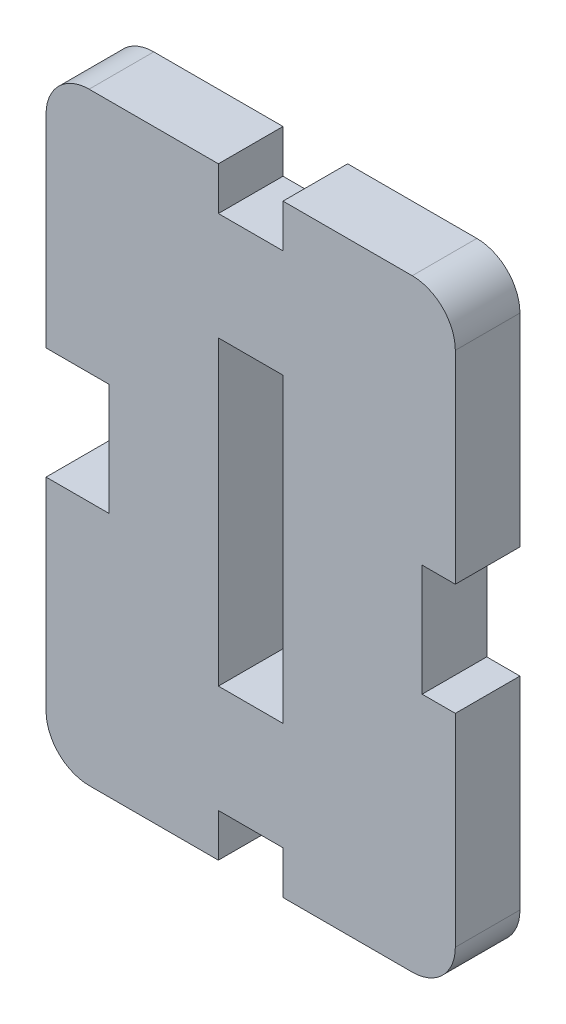
ISO-10303-21;
HEADER;
FILE_DESCRIPTION(('STEP AP214'),'2;1');
FILE_NAME('part.step','',(''),(''),'','','');
FILE_SCHEMA(('AUTOMOTIVE_DESIGN { 1 0 10303 214 1 1 1 1 }'));
ENDSEC;
DATA;
#1=APPLICATION_CONTEXT('core data for automotive mechanical design processes');
#2=APPLICATION_PROTOCOL_DEFINITION('international standard','automotive_design',2000,#1);
#3=PRODUCT_CONTEXT('',#1,'mechanical');
#4=PRODUCT('Part','Part','',(#3));
#5=PRODUCT_RELATED_PRODUCT_CATEGORY('part','',(#4));
#6=PRODUCT_DEFINITION_FORMATION('','',#4);
#7=PRODUCT_DEFINITION_CONTEXT('part definition',#1,'design');
#8=PRODUCT_DEFINITION('design','',#6,#7);
#9=PRODUCT_DEFINITION_SHAPE('','',#8);
#10=(LENGTH_UNIT() NAMED_UNIT(*) SI_UNIT(.MILLI.,.METRE.));
#11=(NAMED_UNIT(*) PLANE_ANGLE_UNIT() SI_UNIT($,.RADIAN.));
#12=(NAMED_UNIT(*) SI_UNIT($,.STERADIAN.) SOLID_ANGLE_UNIT());
#13=UNCERTAINTY_MEASURE_WITH_UNIT(LENGTH_MEASURE(1.E-05),#10,'distance_accuracy_value','');
#14=(GEOMETRIC_REPRESENTATION_CONTEXT(3) GLOBAL_UNCERTAINTY_ASSIGNED_CONTEXT((#13)) GLOBAL_UNIT_ASSIGNED_CONTEXT((#10,
#11,#12)) REPRESENTATION_CONTEXT('',''));
#15=CARTESIAN_POINT('',(0.,0.,0.));
#16=DIRECTION('',(0.,0.,1.));
#17=DIRECTION('',(1.,0.,0.));
#18=AXIS2_PLACEMENT_3D('',#15,#16,#17);
#19=CARTESIAN_POINT('',(-1050.11691061095,53.9977448376059,2.99999999999985));
#20=DIRECTION('',(0.,0.,-1.));
#21=DIRECTION('',(-1.,0.,0.));
#22=AXIS2_PLACEMENT_3D('',#19,#20,#21);
#23=PLANE('',#22);
#24=CARTESIAN_POINT('',(-1050.11691061095,53.9977448376059,2.99999999999985));
#25=DIRECTION('',(0.,0.,1.));
#26=DIRECTION('',(-1.,0.,0.));
#27=AXIS2_PLACEMENT_3D('',#24,#25,#26);
#28=CIRCLE('',#27,2.);
#29=CARTESIAN_POINT('',(-1050.11691061095,55.9977448376057,2.99999999999996));
#30=VERTEX_POINT('',#29);
#31=CARTESIAN_POINT('',(-1052.11691061095,53.9977448376056,2.99999999999989));
#32=VERTEX_POINT('',#31);
#33=EDGE_CURVE('E303',#30,#32,#28,.T.);
#34=ORIENTED_EDGE('',*,*,#33,.T.);
#35=DIRECTION('',(0.,-1.,0.));
#36=VECTOR('',#35,1.);
#37=CARTESIAN_POINT('',(-1052.11691061095,44.5930739118334,2.99999999999999));
#38=LINE('',#37,#36);
#39=CARTESIAN_POINT('',(-1052.11691061095,44.5930739118334,2.99999999999999));
#40=VERTEX_POINT('',#39);
#41=EDGE_CURVE('E306',#32,#40,#38,.T.);
#42=ORIENTED_EDGE('',*,*,#41,.T.);
#43=DIRECTION('',(1.,0.,0.));
#44=VECTOR('',#43,1.);
#45=CARTESIAN_POINT('',(-1049.19041833405,44.5930739118331,2.99999999999993));
#46=LINE('',#45,#44);
#47=CARTESIAN_POINT('',(-1049.19041833405,44.5930739118331,2.99999999999993));
#48=VERTEX_POINT('',#47);
#49=EDGE_CURVE('E308',#40,#48,#46,.T.);
#50=ORIENTED_EDGE('',*,*,#49,.T.);
#51=DIRECTION('',(0.,-1.,0.));
#52=VECTOR('',#51,1.);
#53=CARTESIAN_POINT('',(-1049.19041833405,39.4024157633782,2.99999999999998));
#54=LINE('',#53,#52);
#55=CARTESIAN_POINT('',(-1049.19041833405,39.4024157633782,2.99999999999998));
#56=VERTEX_POINT('',#55);
#57=EDGE_CURVE('E310',#48,#56,#54,.T.);
#58=ORIENTED_EDGE('',*,*,#57,.T.);
#59=DIRECTION('',(-1.,0.,0.));
#60=VECTOR('',#59,1.);
#61=CARTESIAN_POINT('',(-1049.19041833405,39.4024157633782,2.99999999999998));
#62=LINE('',#61,#60);
#63=CARTESIAN_POINT('',(-1052.11691061095,39.4024157633781,2.99999999999988));
#64=VERTEX_POINT('',#63);
#65=EDGE_CURVE('E312',#56,#64,#62,.T.);
#66=ORIENTED_EDGE('',*,*,#65,.T.);
#67=DIRECTION('',(0.,-1.,0.));
#68=VECTOR('',#67,1.);
#69=CARTESIAN_POINT('',(-1052.11691061095,39.4024157633781,2.99999999999988));
#70=LINE('',#69,#68);
#71=CARTESIAN_POINT('',(-1052.11691061095,29.9977448376057,2.99999999999979));
#72=VERTEX_POINT('',#71);
#73=EDGE_CURVE('E314',#64,#72,#70,.T.);
#74=ORIENTED_EDGE('',*,*,#73,.T.);
#75=CARTESIAN_POINT('',(-1050.11691061095,29.9977448376059,2.99999999999993));
#76=DIRECTION('',(0.,0.,1.));
#77=DIRECTION('',(1.,0.,0.));
#78=AXIS2_PLACEMENT_3D('',#75,#76,#77);
#79=CIRCLE('',#78,2.00000000000012);
#80=CARTESIAN_POINT('',(-1050.11691061095,27.9977448376057,2.99999999999996));
#81=VERTEX_POINT('',#80);
#82=EDGE_CURVE('E316',#72,#81,#79,.T.);
#83=ORIENTED_EDGE('',*,*,#82,.T.);
#84=DIRECTION('',(1.,0.,0.));
#85=VECTOR('',#84,1.);
#86=CARTESIAN_POINT('',(-1050.11691061095,27.9977448376057,2.99999999999995));
#87=LINE('',#86,#85);
#88=CARTESIAN_POINT('',(-1044.11691061095,27.9977448376058,3.00000000000009));
#89=VERTEX_POINT('',#88);
#90=EDGE_CURVE('E318',#81,#89,#87,.T.);
#91=ORIENTED_EDGE('',*,*,#90,.T.);
#92=DIRECTION('',(0.,1.,0.));
#93=VECTOR('',#92,1.);
#94=CARTESIAN_POINT('',(-1044.11691061095,29.9977448376057,3.00000000000003));
#95=LINE('',#94,#93);
#96=CARTESIAN_POINT('',(-1044.11691061095,29.9977448376057,3.00000000000003));
#97=VERTEX_POINT('',#96);
#98=EDGE_CURVE('E320',#89,#97,#95,.T.);
#99=ORIENTED_EDGE('',*,*,#98,.T.);
#100=DIRECTION('',(1.,0.,0.));
#101=VECTOR('',#100,1.);
#102=CARTESIAN_POINT('',(-1042.61691061095,29.9977448376059,2.99999999999993));
#103=LINE('',#102,#101);
#104=CARTESIAN_POINT('',(-1041.11691061095,29.9977448376059,2.99999999999993));
#105=VERTEX_POINT('',#104);
#106=EDGE_CURVE('E322',#97,#105,#103,.T.);
#107=ORIENTED_EDGE('',*,*,#106,.T.);
#108=DIRECTION('',(0.,-1.,0.));
#109=VECTOR('',#108,1.);
#110=CARTESIAN_POINT('',(-1041.11691061095,29.9977448376059,2.99999999999993));
#111=LINE('',#110,#109);
#112=CARTESIAN_POINT('',(-1041.11691061095,27.9977448376059,3.00000000000004));
#113=VERTEX_POINT('',#112);
#114=EDGE_CURVE('E324',#105,#113,#111,.T.);
#115=ORIENTED_EDGE('',*,*,#114,.T.);
#116=DIRECTION('',(1.,0.,0.));
#117=VECTOR('',#116,1.);
#118=CARTESIAN_POINT('',(-1041.11691061095,27.9977448376059,3.00000000000004));
#119=LINE('',#118,#117);
#120=CARTESIAN_POINT('',(-1035.11691061095,27.9977448376057,3.00000000000006));
#121=VERTEX_POINT('',#120);
#122=EDGE_CURVE('E326',#113,#121,#119,.T.);
#123=ORIENTED_EDGE('',*,*,#122,.T.);
#124=CARTESIAN_POINT('',(-1035.11691061095,29.9977448376057,2.99999999999991));
#125=DIRECTION('',(0.,0.,1.));
#126=DIRECTION('',(-1.,0.,0.));
#127=AXIS2_PLACEMENT_3D('',#124,#125,#126);
#128=CIRCLE('',#127,2.);
#129=CARTESIAN_POINT('',(-1033.11691061095,29.9977448376056,2.99999999999991));
#130=VERTEX_POINT('',#129);
#131=EDGE_CURVE('E328',#121,#130,#128,.T.);
#132=ORIENTED_EDGE('',*,*,#131,.T.);
#133=DIRECTION('',(0.,1.,0.));
#134=VECTOR('',#133,1.);
#135=CARTESIAN_POINT('',(-1033.11691061095,29.9977448376056,2.99999999999991));
#136=LINE('',#135,#134);
#137=CARTESIAN_POINT('',(-1033.11691061095,39.4024157633782,2.99999999999999));
#138=VERTEX_POINT('',#137);
#139=EDGE_CURVE('E330',#130,#138,#136,.T.);
#140=ORIENTED_EDGE('',*,*,#139,.T.);
#141=DIRECTION('',(-1.,0.,0.));
#142=VECTOR('',#141,1.);
#143=CARTESIAN_POINT('',(-1033.11691061095,39.4024157633782,2.99999999999999));
#144=LINE('',#143,#142);
#145=CARTESIAN_POINT('',(-1034.65769352971,39.4024157633784,3.00000000000013));
#146=VERTEX_POINT('',#145);
#147=EDGE_CURVE('E332',#138,#146,#144,.T.);
#148=ORIENTED_EDGE('',*,*,#147,.T.);
#149=DIRECTION('',(0.,1.,0.));
#150=VECTOR('',#149,1.);
#151=CARTESIAN_POINT('',(-1034.65769352971,44.5930739118334,2.99999999999999));
#152=LINE('',#151,#150);
#153=CARTESIAN_POINT('',(-1034.65769352971,44.5930739118334,2.99999999999999));
#154=VERTEX_POINT('',#153);
#155=EDGE_CURVE('E334',#146,#154,#152,.T.);
#156=ORIENTED_EDGE('',*,*,#155,.T.);
#157=DIRECTION('',(1.,0.,0.));
#158=VECTOR('',#157,1.);
#159=CARTESIAN_POINT('',(-1033.11691061095,44.5930739118332,3.00000000000004));
#160=LINE('',#159,#158);
#161=CARTESIAN_POINT('',(-1033.11691061095,44.5930739118332,3.00000000000004));
#162=VERTEX_POINT('',#161);
#163=EDGE_CURVE('E336',#154,#162,#160,.T.);
#164=ORIENTED_EDGE('',*,*,#163,.T.);
#165=DIRECTION('',(0.,1.,0.));
#166=VECTOR('',#165,1.);
#167=CARTESIAN_POINT('',(-1033.11691061095,53.9977448376056,2.99999999999991));
#168=LINE('',#167,#166);
#169=CARTESIAN_POINT('',(-1033.11691061095,53.9977448376056,2.99999999999991));
#170=VERTEX_POINT('',#169);
#171=EDGE_CURVE('E338',#162,#170,#168,.T.);
#172=ORIENTED_EDGE('',*,*,#171,.T.);
#173=CARTESIAN_POINT('',(-1035.11691061095,53.9977448376058,2.99999999999998));
#174=DIRECTION('',(0.,0.,1.));
#175=DIRECTION('',(1.,0.,0.));
#176=AXIS2_PLACEMENT_3D('',#173,#174,#175);
#177=CIRCLE('',#176,2.);
#178=CARTESIAN_POINT('',(-1035.11691061095,55.9977448376059,2.99999999999991));
#179=VERTEX_POINT('',#178);
#180=EDGE_CURVE('E340',#170,#179,#177,.T.);
#181=ORIENTED_EDGE('',*,*,#180,.T.);
#182=DIRECTION('',(-1.,0.,0.));
#183=VECTOR('',#182,1.);
#184=CARTESIAN_POINT('',(-1041.11691061095,55.9977448376058,3.00000000000013));
#185=LINE('',#184,#183);
#186=CARTESIAN_POINT('',(-1041.11691061095,55.9977448376058,3.00000000000013));
#187=VERTEX_POINT('',#186);
#188=EDGE_CURVE('E342',#179,#187,#185,.T.);
#189=ORIENTED_EDGE('',*,*,#188,.T.);
#190=DIRECTION('',(0.,-1.,0.));
#191=VECTOR('',#190,1.);
#192=CARTESIAN_POINT('',(-1041.11691061095,53.9977448376059,3.00000000000009));
#193=LINE('',#192,#191);
#194=CARTESIAN_POINT('',(-1041.11691061095,53.9977448376059,3.00000000000009));
#195=VERTEX_POINT('',#194);
#196=EDGE_CURVE('E344',#187,#195,#193,.T.);
#197=ORIENTED_EDGE('',*,*,#196,.T.);
#198=DIRECTION('',(-1.,0.,0.));
#199=VECTOR('',#198,1.);
#200=CARTESIAN_POINT('',(-1042.61691061095,53.9977448376058,2.99999999999991));
#201=LINE('',#200,#199);
#202=CARTESIAN_POINT('',(-1044.11691061095,53.9977448376058,3.00000000000009));
#203=VERTEX_POINT('',#202);
#204=EDGE_CURVE('E346',#195,#203,#201,.T.);
#205=ORIENTED_EDGE('',*,*,#204,.T.);
#206=DIRECTION('',(0.,1.,0.));
#207=VECTOR('',#206,1.);
#208=CARTESIAN_POINT('',(-1044.11691061095,53.9977448376058,3.00000000000009));
#209=LINE('',#208,#207);
#210=CARTESIAN_POINT('',(-1044.11691061095,55.9977448376059,3.0000000000001));
#211=VERTEX_POINT('',#210);
#212=EDGE_CURVE('E348',#203,#211,#209,.T.);
#213=ORIENTED_EDGE('',*,*,#212,.T.);
#214=DIRECTION('',(-1.,0.,0.));
#215=VECTOR('',#214,1.);
#216=CARTESIAN_POINT('',(-1050.11691061095,55.9977448376057,2.99999999999996));
#217=LINE('',#216,#215);
#218=EDGE_CURVE('E350',#211,#30,#217,.T.);
#219=ORIENTED_EDGE('',*,*,#218,.T.);
#220=EDGE_LOOP('',(#34,#42,#50,#58,#66,#74,#83,#91,#99,#107,#115,#123,#132,#140,#148,#156,#164,
#172,#181,#189,#197,#205,#213,#219));
#221=FACE_BOUND('',#220,.T.);
#222=DIRECTION('',(-1.,0.,0.));
#223=VECTOR('',#222,1.);
#224=CARTESIAN_POINT('',(-1041.11691061095,48.9977448376058,3.00000000000011));
#225=LINE('',#224,#223);
#226=CARTESIAN_POINT('',(-1041.11691061095,48.9977448376058,3.00000000000011));
#227=VERTEX_POINT('',#226);
#228=CARTESIAN_POINT('',(-1044.11691061095,48.9977448376058,3.00000000000004));
#229=VERTEX_POINT('',#228);
#230=EDGE_CURVE('E232',#227,#229,#225,.T.);
#231=ORIENTED_EDGE('',*,*,#230,.F.);
#232=DIRECTION('',(0.,1.,0.));
#233=VECTOR('',#232,1.);
#234=CARTESIAN_POINT('',(-1041.11691061095,34.9977448376059,3.00000000000013));
#235=LINE('',#234,#233);
#236=CARTESIAN_POINT('',(-1041.11691061095,34.9977448376059,3.00000000000013));
#237=VERTEX_POINT('',#236);
#238=EDGE_CURVE('E247',#237,#227,#235,.T.);
#239=ORIENTED_EDGE('',*,*,#238,.F.);
#240=DIRECTION('',(1.,0.,0.));
#241=VECTOR('',#240,1.);
#242=CARTESIAN_POINT('',(-1041.11691061095,34.9977448376059,3.00000000000013));
#243=LINE('',#242,#241);
#244=CARTESIAN_POINT('',(-1044.11691061095,34.9977448376058,3.00000000000006));
#245=VERTEX_POINT('',#244);
#246=EDGE_CURVE('E245',#245,#237,#243,.T.);
#247=ORIENTED_EDGE('',*,*,#246,.F.);
#248=DIRECTION('',(0.,-1.,0.));
#249=VECTOR('',#248,1.);
#250=CARTESIAN_POINT('',(-1044.11691061095,48.9977448376058,3.00000000000004));
#251=LINE('',#250,#249);
#252=EDGE_CURVE('E243',#229,#245,#251,.T.);
#253=ORIENTED_EDGE('',*,*,#252,.F.);
#254=EDGE_LOOP('',(#231,#239,#247,#253));
#255=FACE_BOUND('',#254,.T.);
#256=ADVANCED_FACE('F32',(#221,#255),#23,.F.);
#257=CARTESIAN_POINT('',(-1050.11691061095,53.9977448376059,0.));
#258=DIRECTION('',(0.,0.,-1.));
#259=DIRECTION('',(-1.,0.,0.));
#260=AXIS2_PLACEMENT_3D('',#257,#258,#259);
#261=PLANE('',#260);
#262=CARTESIAN_POINT('',(-1050.11691061095,53.9977448376059,0.));
#263=DIRECTION('',(0.,0.,1.));
#264=DIRECTION('',(-1.,0.,0.));
#265=AXIS2_PLACEMENT_3D('',#262,#263,#264);
#266=CIRCLE('',#265,2.);
#267=CARTESIAN_POINT('',(-1050.11691061095,55.9977448376057,0.));
#268=VERTEX_POINT('',#267);
#269=CARTESIAN_POINT('',(-1052.11691061095,53.9977448376056,0.));
#270=VERTEX_POINT('',#269);
#271=EDGE_CURVE('E233',#268,#270,#266,.T.);
#272=ORIENTED_EDGE('',*,*,#271,.F.);
#273=DIRECTION('',(-1.,0.,0.));
#274=VECTOR('',#273,1.);
#275=CARTESIAN_POINT('',(-1050.11691061095,55.9977448376057,0.));
#276=LINE('',#275,#274);
#277=CARTESIAN_POINT('',(-1044.11691061095,55.9977448376058,0.));
#278=VERTEX_POINT('',#277);
#279=EDGE_CURVE('E301',#278,#268,#276,.T.);
#280=ORIENTED_EDGE('',*,*,#279,.F.);
#281=DIRECTION('',(0.,1.,0.));
#282=VECTOR('',#281,1.);
#283=CARTESIAN_POINT('',(-1044.11691061095,53.9977448376058,0.));
#284=LINE('',#283,#282);
#285=CARTESIAN_POINT('',(-1044.11691061095,53.9977448376058,0.));
#286=VERTEX_POINT('',#285);
#287=EDGE_CURVE('E299',#286,#278,#284,.T.);
#288=ORIENTED_EDGE('',*,*,#287,.F.);
#289=DIRECTION('',(-1.,0.,0.));
#290=VECTOR('',#289,1.);
#291=CARTESIAN_POINT('',(-1042.61691061095,53.9977448376059,0.));
#292=LINE('',#291,#290);
#293=CARTESIAN_POINT('',(-1041.11691061095,53.9977448376059,0.));
#294=VERTEX_POINT('',#293);
#295=EDGE_CURVE('E297',#294,#286,#292,.T.);
#296=ORIENTED_EDGE('',*,*,#295,.F.);
#297=DIRECTION('',(0.,-1.,0.));
#298=VECTOR('',#297,1.);
#299=CARTESIAN_POINT('',(-1041.11691061095,53.9977448376059,0.));
#300=LINE('',#299,#298);
#301=CARTESIAN_POINT('',(-1041.11691061095,55.9977448376058,0.));
#302=VERTEX_POINT('',#301);
#303=EDGE_CURVE('E294',#302,#294,#300,.T.);
#304=ORIENTED_EDGE('',*,*,#303,.F.);
#305=DIRECTION('',(-1.,0.,0.));
#306=VECTOR('',#305,1.);
#307=CARTESIAN_POINT('',(-1041.11691061095,55.9977448376058,0.));
#308=LINE('',#307,#306);
#309=CARTESIAN_POINT('',(-1035.11691061095,55.9977448376056,0.));
#310=VERTEX_POINT('',#309);
#311=EDGE_CURVE('E292',#310,#302,#308,.T.);
#312=ORIENTED_EDGE('',*,*,#311,.F.);
#313=CARTESIAN_POINT('',(-1035.11691061095,53.9977448376057,0.));
#314=DIRECTION('',(0.,0.,1.));
#315=DIRECTION('',(1.,0.,0.));
#316=AXIS2_PLACEMENT_3D('',#313,#314,#315);
#317=CIRCLE('',#316,2.);
#318=CARTESIAN_POINT('',(-1033.11691061095,53.9977448376057,0.));
#319=VERTEX_POINT('',#318);
#320=EDGE_CURVE('E290',#319,#310,#317,.T.);
#321=ORIENTED_EDGE('',*,*,#320,.F.);
#322=DIRECTION('',(0.,1.,0.));
#323=VECTOR('',#322,1.);
#324=CARTESIAN_POINT('',(-1033.11691061095,53.9977448376057,0.));
#325=LINE('',#324,#323);
#326=CARTESIAN_POINT('',(-1033.11691061095,44.593073911833,0.));
#327=VERTEX_POINT('',#326);
#328=EDGE_CURVE('E288',#327,#319,#325,.T.);
#329=ORIENTED_EDGE('',*,*,#328,.F.);
#330=DIRECTION('',(1.,0.,0.));
#331=VECTOR('',#330,1.);
#332=CARTESIAN_POINT('',(-1033.11691061095,44.593073911833,0.));
#333=LINE('',#332,#331);
#334=CARTESIAN_POINT('',(-1034.65769352971,44.5930739118333,0.));
#335=VERTEX_POINT('',#334);
#336=EDGE_CURVE('E286',#335,#327,#333,.T.);
#337=ORIENTED_EDGE('',*,*,#336,.F.);
#338=DIRECTION('',(0.,1.,0.));
#339=VECTOR('',#338,1.);
#340=CARTESIAN_POINT('',(-1034.65769352971,44.5930739118333,0.));
#341=LINE('',#340,#339);
#342=CARTESIAN_POINT('',(-1034.65769352971,39.4024157633785,0.));
#343=VERTEX_POINT('',#342);
#344=EDGE_CURVE('E284',#343,#335,#341,.T.);
#345=ORIENTED_EDGE('',*,*,#344,.F.);
#346=DIRECTION('',(-1.,0.,0.));
#347=VECTOR('',#346,1.);
#348=CARTESIAN_POINT('',(-1033.11691061095,39.4024157633783,0.));
#349=LINE('',#348,#347);
#350=CARTESIAN_POINT('',(-1033.11691061095,39.4024157633783,0.));
#351=VERTEX_POINT('',#350);
#352=EDGE_CURVE('E282',#351,#343,#349,.T.);
#353=ORIENTED_EDGE('',*,*,#352,.F.);
#354=DIRECTION('',(0.,1.,0.));
#355=VECTOR('',#354,1.);
#356=CARTESIAN_POINT('',(-1033.11691061095,29.9977448376057,0.));
#357=LINE('',#356,#355);
#358=CARTESIAN_POINT('',(-1033.11691061095,29.9977448376057,0.));
#359=VERTEX_POINT('',#358);
#360=EDGE_CURVE('E280',#359,#351,#357,.T.);
#361=ORIENTED_EDGE('',*,*,#360,.F.);
#362=CARTESIAN_POINT('',(-1035.11691061095,29.9977448376058,0.));
#363=DIRECTION('',(0.,0.,1.));
#364=DIRECTION('',(-1.,0.,0.));
#365=AXIS2_PLACEMENT_3D('',#362,#363,#364);
#366=CIRCLE('',#365,2.);
#367=CARTESIAN_POINT('',(-1035.11691061095,27.9977448376058,0.));
#368=VERTEX_POINT('',#367);
#369=EDGE_CURVE('E278',#368,#359,#366,.T.);
#370=ORIENTED_EDGE('',*,*,#369,.F.);
#371=DIRECTION('',(1.,0.,0.));
#372=VECTOR('',#371,1.);
#373=CARTESIAN_POINT('',(-1041.11691061095,27.9977448376059,0.));
#374=LINE('',#373,#372);
#375=CARTESIAN_POINT('',(-1041.11691061095,27.9977448376059,0.));
#376=VERTEX_POINT('',#375);
#377=EDGE_CURVE('E276',#376,#368,#374,.T.);
#378=ORIENTED_EDGE('',*,*,#377,.F.);
#379=DIRECTION('',(0.,-1.,0.));
#380=VECTOR('',#379,1.);
#381=CARTESIAN_POINT('',(-1041.11691061095,29.9977448376058,0.));
#382=LINE('',#381,#380);
#383=CARTESIAN_POINT('',(-1041.11691061095,29.9977448376058,0.));
#384=VERTEX_POINT('',#383);
#385=EDGE_CURVE('E274',#384,#376,#382,.T.);
#386=ORIENTED_EDGE('',*,*,#385,.F.);
#387=DIRECTION('',(1.,0.,0.));
#388=VECTOR('',#387,1.);
#389=CARTESIAN_POINT('',(-1042.61691061095,29.997744837606,-1.11022302462516E-13));
#390=LINE('',#389,#388);
#391=CARTESIAN_POINT('',(-1044.11691061095,29.9977448376059,1.66533453693773E-13));
#392=VERTEX_POINT('',#391);
#393=EDGE_CURVE('E272',#392,#384,#390,.T.);
#394=ORIENTED_EDGE('',*,*,#393,.F.);
#395=DIRECTION('',(0.,1.,0.));
#396=VECTOR('',#395,1.);
#397=CARTESIAN_POINT('',(-1044.11691061095,29.9977448376059,1.66533453693773E-13));
#398=LINE('',#397,#396);
#399=CARTESIAN_POINT('',(-1044.11691061095,27.9977448376057,0.));
#400=VERTEX_POINT('',#399);
#401=EDGE_CURVE('E269',#400,#392,#398,.T.);
#402=ORIENTED_EDGE('',*,*,#401,.F.);
#403=DIRECTION('',(1.,0.,0.));
#404=VECTOR('',#403,1.);
#405=CARTESIAN_POINT('',(-1050.11691061095,27.9977448376057,0.));
#406=LINE('',#405,#404);
#407=CARTESIAN_POINT('',(-1050.11691061095,27.9977448376057,0.));
#408=VERTEX_POINT('',#407);
#409=EDGE_CURVE('E267',#408,#400,#406,.T.);
#410=ORIENTED_EDGE('',*,*,#409,.F.);
#411=CARTESIAN_POINT('',(-1050.11691061095,29.9977448376056,0.));
#412=DIRECTION('',(0.,0.,1.));
#413=DIRECTION('',(1.,0.,0.));
#414=AXIS2_PLACEMENT_3D('',#411,#412,#413);
#415=CIRCLE('',#414,2.00000000000012);
#416=CARTESIAN_POINT('',(-1052.11691061095,29.9977448376057,0.));
#417=VERTEX_POINT('',#416);
#418=EDGE_CURVE('E265',#417,#408,#415,.T.);
#419=ORIENTED_EDGE('',*,*,#418,.F.);
#420=DIRECTION('',(0.,-1.,0.));
#421=VECTOR('',#420,1.);
#422=CARTESIAN_POINT('',(-1052.11691061095,39.4024157633781,0.));
#423=LINE('',#422,#421);
#424=CARTESIAN_POINT('',(-1052.11691061095,39.4024157633781,0.));
#425=VERTEX_POINT('',#424);
#426=EDGE_CURVE('E263',#425,#417,#423,.T.);
#427=ORIENTED_EDGE('',*,*,#426,.F.);
#428=DIRECTION('',(-1.,0.,0.));
#429=VECTOR('',#428,1.);
#430=CARTESIAN_POINT('',(-1049.19041833405,39.4024157633781,-1.11022302462516E-13));
#431=LINE('',#430,#429);
#432=CARTESIAN_POINT('',(-1049.19041833405,39.4024157633781,-1.11022302462516E-13));
#433=VERTEX_POINT('',#432);
#434=EDGE_CURVE('E261',#433,#425,#431,.T.);
#435=ORIENTED_EDGE('',*,*,#434,.F.);
#436=DIRECTION('',(0.,-1.,0.));
#437=VECTOR('',#436,1.);
#438=CARTESIAN_POINT('',(-1049.19041833405,39.4024157633781,-1.11022302462516E-13));
#439=LINE('',#438,#437);
#440=CARTESIAN_POINT('',(-1049.19041833405,44.5930739118332,0.));
#441=VERTEX_POINT('',#440);
#442=EDGE_CURVE('E259',#441,#433,#439,.T.);
#443=ORIENTED_EDGE('',*,*,#442,.F.);
#444=DIRECTION('',(1.,0.,0.));
#445=VECTOR('',#444,1.);
#446=CARTESIAN_POINT('',(-1049.19041833405,44.5930739118332,0.));
#447=LINE('',#446,#445);
#448=CARTESIAN_POINT('',(-1052.11691061095,44.593073911833,0.));
#449=VERTEX_POINT('',#448);
#450=EDGE_CURVE('E257',#449,#441,#447,.T.);
#451=ORIENTED_EDGE('',*,*,#450,.F.);
#452=DIRECTION('',(0.,-1.,0.));
#453=VECTOR('',#452,1.);
#454=CARTESIAN_POINT('',(-1052.11691061095,44.593073911833,0.));
#455=LINE('',#454,#453);
#456=EDGE_CURVE('E255',#270,#449,#455,.T.);
#457=ORIENTED_EDGE('',*,*,#456,.F.);
#458=EDGE_LOOP('',(#272,#280,#288,#296,#304,#312,#321,#329,#337,#345,#353,#361,#370,#378,#386,
#394,#402,#410,#419,#427,#435,#443,#451,#457));
#459=FACE_BOUND('',#458,.T.);
#460=DIRECTION('',(0.,1.,0.));
#461=VECTOR('',#460,1.);
#462=CARTESIAN_POINT('',(-1041.11691061095,34.9977448376058,0.));
#463=LINE('',#462,#461);
#464=CARTESIAN_POINT('',(-1041.11691061095,34.9977448376058,0.));
#465=VERTEX_POINT('',#464);
#466=CARTESIAN_POINT('',(-1041.11691061095,48.9977448376059,0.));
#467=VERTEX_POINT('',#466);
#468=EDGE_CURVE('E237',#465,#467,#463,.T.);
#469=ORIENTED_EDGE('',*,*,#468,.T.);
#470=DIRECTION('',(-1.,0.,0.));
#471=VECTOR('',#470,1.);
#472=CARTESIAN_POINT('',(-1041.11691061095,48.9977448376059,0.));
#473=LINE('',#472,#471);
#474=CARTESIAN_POINT('',(-1044.11691061095,48.9977448376059,0.));
#475=VERTEX_POINT('',#474);
#476=EDGE_CURVE('E55',#467,#475,#473,.T.);
#477=ORIENTED_EDGE('',*,*,#476,.T.);
#478=DIRECTION('',(0.,-1.,0.));
#479=VECTOR('',#478,1.);
#480=CARTESIAN_POINT('',(-1044.11691061095,48.9977448376059,0.));
#481=LINE('',#480,#479);
#482=CARTESIAN_POINT('',(-1044.11691061095,34.9977448376057,0.));
#483=VERTEX_POINT('',#482);
#484=EDGE_CURVE('E219',#475,#483,#481,.T.);
#485=ORIENTED_EDGE('',*,*,#484,.T.);
#486=DIRECTION('',(1.,0.,0.));
#487=VECTOR('',#486,1.);
#488=CARTESIAN_POINT('',(-1041.11691061095,34.9977448376058,0.));
#489=LINE('',#488,#487);
#490=EDGE_CURVE('E228',#483,#465,#489,.T.);
#491=ORIENTED_EDGE('',*,*,#490,.T.);
#492=EDGE_LOOP('',(#469,#477,#485,#491));
#493=FACE_BOUND('',#492,.T.);
#494=ADVANCED_FACE('F236',(#459,#493),#261,.T.);
#495=CARTESIAN_POINT('',(-1050.11691061095,53.9977448376059,2.99999999999985));
#496=DIRECTION('',(0.,0.,-1.));
#497=DIRECTION('',(-1.,0.,0.));
#498=AXIS2_PLACEMENT_3D('',#495,#496,#497);
#499=CYLINDRICAL_SURFACE('',#498,2.);
#500=ORIENTED_EDGE('',*,*,#271,.T.);
#501=DIRECTION('',(0.,0.,-1.));
#502=VECTOR('',#501,1.);
#503=CARTESIAN_POINT('',(-1052.11691061095,53.9977448376056,2.99999999999989));
#504=LINE('',#503,#502);
#505=EDGE_CURVE('E11',#32,#270,#504,.T.);
#506=ORIENTED_EDGE('',*,*,#505,.F.);
#507=ORIENTED_EDGE('',*,*,#33,.F.);
#508=DIRECTION('',(0.,0.,-1.));
#509=VECTOR('',#508,1.);
#510=CARTESIAN_POINT('',(-1050.11691061095,55.9977448376057,2.99999999999996));
#511=LINE('',#510,#509);
#512=EDGE_CURVE('E352',#30,#268,#511,.T.);
#513=ORIENTED_EDGE('',*,*,#512,.T.);
#514=EDGE_LOOP('',(#500,#506,#507,#513));
#515=FACE_BOUND('',#514,.T.);
#516=ADVANCED_FACE('F34',(#515),#499,.T.);
#517=CARTESIAN_POINT('',(-1052.11691061095,44.5930739118334,2.99999999999999));
#518=DIRECTION('',(1.,0.,0.));
#519=DIRECTION('',(0.,1.,0.));
#520=AXIS2_PLACEMENT_3D('',#517,#518,#519);
#521=PLANE('',#520);
#522=ORIENTED_EDGE('',*,*,#456,.T.);
#523=DIRECTION('',(0.,0.,-1.));
#524=VECTOR('',#523,1.);
#525=CARTESIAN_POINT('',(-1052.11691061095,44.5930739118334,2.99999999999999));
#526=LINE('',#525,#524);
#527=EDGE_CURVE('E40',#40,#449,#526,.T.);
#528=ORIENTED_EDGE('',*,*,#527,.F.);
#529=ORIENTED_EDGE('',*,*,#41,.F.);
#530=ORIENTED_EDGE('',*,*,#505,.T.);
#531=EDGE_LOOP('',(#522,#528,#529,#530));
#532=FACE_BOUND('',#531,.T.);
#533=ADVANCED_FACE('F444',(#532),#521,.F.);
#534=CARTESIAN_POINT('',(-1049.19041833405,44.5930739118331,2.99999999999993));
#535=DIRECTION('',(0.,1.,0.));
#536=DIRECTION('',(0.,0.,1.));
#537=AXIS2_PLACEMENT_3D('',#534,#535,#536);
#538=PLANE('',#537);
#539=ORIENTED_EDGE('',*,*,#450,.T.);
#540=DIRECTION('',(0.,0.,-1.));
#541=VECTOR('',#540,1.);
#542=CARTESIAN_POINT('',(-1049.19041833405,44.5930739118331,2.99999999999993));
#543=LINE('',#542,#541);
#544=EDGE_CURVE('E415',#48,#441,#543,.T.);
#545=ORIENTED_EDGE('',*,*,#544,.F.);
#546=ORIENTED_EDGE('',*,*,#49,.F.);
#547=ORIENTED_EDGE('',*,*,#527,.T.);
#548=EDGE_LOOP('',(#539,#545,#546,#547));
#549=FACE_BOUND('',#548,.T.);
#550=ADVANCED_FACE('F422',(#549),#538,.F.);
#551=CARTESIAN_POINT('',(-1049.19041833405,39.4024157633782,2.99999999999998));
#552=DIRECTION('',(1.,0.,0.));
#553=DIRECTION('',(0.,0.,-1.));
#554=AXIS2_PLACEMENT_3D('',#551,#552,#553);
#555=PLANE('',#554);
#556=ORIENTED_EDGE('',*,*,#442,.T.);
#557=DIRECTION('',(0.,0.,-1.));
#558=VECTOR('',#557,1.);
#559=CARTESIAN_POINT('',(-1049.19041833405,39.4024157633782,2.99999999999998));
#560=LINE('',#559,#558);
#561=EDGE_CURVE('E412',#56,#433,#560,.T.);
#562=ORIENTED_EDGE('',*,*,#561,.F.);
#563=ORIENTED_EDGE('',*,*,#57,.F.);
#564=ORIENTED_EDGE('',*,*,#544,.T.);
#565=EDGE_LOOP('',(#556,#562,#563,#564));
#566=FACE_BOUND('',#565,.T.);
#567=ADVANCED_FACE('F432',(#566),#555,.F.);
#568=CARTESIAN_POINT('',(-1049.19041833405,39.4024157633782,2.99999999999998));
#569=DIRECTION('',(0.,-1.,0.));
#570=DIRECTION('',(0.,0.,-1.));
#571=AXIS2_PLACEMENT_3D('',#568,#569,#570);
#572=PLANE('',#571);
#573=ORIENTED_EDGE('',*,*,#434,.T.);
#574=DIRECTION('',(0.,0.,-1.));
#575=VECTOR('',#574,1.);
#576=CARTESIAN_POINT('',(-1052.11691061095,39.4024157633781,2.99999999999988));
#577=LINE('',#576,#575);
#578=EDGE_CURVE('E409',#64,#425,#577,.T.);
#579=ORIENTED_EDGE('',*,*,#578,.F.);
#580=ORIENTED_EDGE('',*,*,#65,.F.);
#581=ORIENTED_EDGE('',*,*,#561,.T.);
#582=EDGE_LOOP('',(#573,#579,#580,#581));
#583=FACE_BOUND('',#582,.T.);
#584=ADVANCED_FACE('F436',(#583),#572,.F.);
#585=CARTESIAN_POINT('',(-1052.11691061095,39.4024157633781,2.99999999999988));
#586=DIRECTION('',(1.,0.,0.));
#587=DIRECTION('',(0.,1.,0.));
#588=AXIS2_PLACEMENT_3D('',#585,#586,#587);
#589=PLANE('',#588);
#590=ORIENTED_EDGE('',*,*,#426,.T.);
#591=DIRECTION('',(0.,0.,-1.));
#592=VECTOR('',#591,1.);
#593=CARTESIAN_POINT('',(-1052.11691061095,29.9977448376057,2.99999999999979));
#594=LINE('',#593,#592);
#595=EDGE_CURVE('E406',#72,#417,#594,.T.);
#596=ORIENTED_EDGE('',*,*,#595,.F.);
#597=ORIENTED_EDGE('',*,*,#73,.F.);
#598=ORIENTED_EDGE('',*,*,#578,.T.);
#599=EDGE_LOOP('',(#590,#596,#597,#598));
#600=FACE_BOUND('',#599,.T.);
#601=ADVANCED_FACE('F535',(#600),#589,.F.);
#602=CARTESIAN_POINT('',(-1050.11691061095,29.9977448376059,2.99999999999993));
#603=DIRECTION('',(0.,0.,-1.));
#604=DIRECTION('',(-1.,0.,0.));
#605=AXIS2_PLACEMENT_3D('',#602,#603,#604);
#606=CYLINDRICAL_SURFACE('',#605,2.00000000000012);
#607=ORIENTED_EDGE('',*,*,#418,.T.);
#608=DIRECTION('',(0.,0.,-1.));
#609=VECTOR('',#608,1.);
#610=CARTESIAN_POINT('',(-1050.11691061095,27.9977448376057,2.99999999999996));
#611=LINE('',#610,#609);
#612=EDGE_CURVE('E403',#81,#408,#611,.T.);
#613=ORIENTED_EDGE('',*,*,#612,.F.);
#614=ORIENTED_EDGE('',*,*,#82,.F.);
#615=ORIENTED_EDGE('',*,*,#595,.T.);
#616=EDGE_LOOP('',(#607,#613,#614,#615));
#617=FACE_BOUND('',#616,.T.);
#618=ADVANCED_FACE('F533',(#617),#606,.T.);
#619=CARTESIAN_POINT('',(-1050.11691061095,27.9977448376057,2.99999999999995));
#620=DIRECTION('',(0.,1.,0.));
#621=DIRECTION('',(-1.,0.,0.));
#622=AXIS2_PLACEMENT_3D('',#619,#620,#621);
#623=PLANE('',#622);
#624=ORIENTED_EDGE('',*,*,#409,.T.);
#625=DIRECTION('',(0.,0.,-1.));
#626=VECTOR('',#625,1.);
#627=CARTESIAN_POINT('',(-1044.11691061095,27.9977448376058,3.00000000000009));
#628=LINE('',#627,#626);
#629=EDGE_CURVE('E400',#89,#400,#628,.T.);
#630=ORIENTED_EDGE('',*,*,#629,.F.);
#631=ORIENTED_EDGE('',*,*,#90,.F.);
#632=ORIENTED_EDGE('',*,*,#612,.T.);
#633=EDGE_LOOP('',(#624,#630,#631,#632));
#634=FACE_BOUND('',#633,.T.);
#635=ADVANCED_FACE('F530',(#634),#623,.F.);
#636=CARTESIAN_POINT('',(-1044.11691061095,29.9977448376057,3.00000000000003));
#637=DIRECTION('',(-1.,0.,0.));
#638=DIRECTION('',(0.,0.,1.));
#639=AXIS2_PLACEMENT_3D('',#636,#637,#638);
#640=PLANE('',#639);
#641=ORIENTED_EDGE('',*,*,#401,.T.);
#642=DIRECTION('',(0.,0.,-1.));
#643=VECTOR('',#642,1.);
#644=CARTESIAN_POINT('',(-1044.11691061095,29.9977448376057,3.00000000000003));
#645=LINE('',#644,#643);
#646=EDGE_CURVE('E397',#97,#392,#645,.T.);
#647=ORIENTED_EDGE('',*,*,#646,.F.);
#648=ORIENTED_EDGE('',*,*,#98,.F.);
#649=ORIENTED_EDGE('',*,*,#629,.T.);
#650=EDGE_LOOP('',(#641,#647,#648,#649));
#651=FACE_BOUND('',#650,.T.);
#652=ADVANCED_FACE('F521',(#651),#640,.F.);
#653=CARTESIAN_POINT('',(-1042.61691061095,29.9977448376059,2.99999999999993));
#654=DIRECTION('',(0.,1.,0.));
#655=DIRECTION('',(0.,0.,1.));
#656=AXIS2_PLACEMENT_3D('',#653,#654,#655);
#657=PLANE('',#656);
#658=ORIENTED_EDGE('',*,*,#393,.T.);
#659=DIRECTION('',(0.,0.,-1.));
#660=VECTOR('',#659,1.);
#661=CARTESIAN_POINT('',(-1041.11691061095,29.9977448376059,2.99999999999993));
#662=LINE('',#661,#660);
#663=EDGE_CURVE('E394',#105,#384,#662,.T.);
#664=ORIENTED_EDGE('',*,*,#663,.F.);
#665=ORIENTED_EDGE('',*,*,#106,.F.);
#666=ORIENTED_EDGE('',*,*,#646,.T.);
#667=EDGE_LOOP('',(#658,#664,#665,#666));
#668=FACE_BOUND('',#667,.T.);
#669=ADVANCED_FACE('F525',(#668),#657,.F.);
#670=CARTESIAN_POINT('',(-1041.11691061095,29.9977448376059,2.99999999999993));
#671=DIRECTION('',(1.,0.,0.));
#672=DIRECTION('',(0.,0.,-1.));
#673=AXIS2_PLACEMENT_3D('',#670,#671,#672);
#674=PLANE('',#673);
#675=ORIENTED_EDGE('',*,*,#385,.T.);
#676=DIRECTION('',(0.,0.,-1.));
#677=VECTOR('',#676,1.);
#678=CARTESIAN_POINT('',(-1041.11691061095,27.9977448376059,3.00000000000004));
#679=LINE('',#678,#677);
#680=EDGE_CURVE('E391',#113,#376,#679,.T.);
#681=ORIENTED_EDGE('',*,*,#680,.F.);
#682=ORIENTED_EDGE('',*,*,#114,.F.);
#683=ORIENTED_EDGE('',*,*,#663,.T.);
#684=EDGE_LOOP('',(#675,#681,#682,#683));
#685=FACE_BOUND('',#684,.T.);
#686=ADVANCED_FACE('F514',(#685),#674,.F.);
#687=CARTESIAN_POINT('',(-1041.11691061095,27.9977448376059,3.00000000000004));
#688=DIRECTION('',(0.,1.,0.));
#689=DIRECTION('',(0.,0.,1.));
#690=AXIS2_PLACEMENT_3D('',#687,#688,#689);
#691=PLANE('',#690);
#692=ORIENTED_EDGE('',*,*,#377,.T.);
#693=DIRECTION('',(0.,0.,-1.));
#694=VECTOR('',#693,1.);
#695=CARTESIAN_POINT('',(-1035.11691061095,27.9977448376057,3.00000000000006));
#696=LINE('',#695,#694);
#697=EDGE_CURVE('E388',#121,#368,#696,.T.);
#698=ORIENTED_EDGE('',*,*,#697,.F.);
#699=ORIENTED_EDGE('',*,*,#122,.F.);
#700=ORIENTED_EDGE('',*,*,#680,.T.);
#701=EDGE_LOOP('',(#692,#698,#699,#700));
#702=FACE_BOUND('',#701,.T.);
#703=ADVANCED_FACE('F510',(#702),#691,.F.);
#704=CARTESIAN_POINT('',(-1035.11691061095,29.9977448376057,2.99999999999991));
#705=DIRECTION('',(0.,0.,-1.));
#706=DIRECTION('',(-1.,0.,0.));
#707=AXIS2_PLACEMENT_3D('',#704,#705,#706);
#708=CYLINDRICAL_SURFACE('',#707,2.);
#709=ORIENTED_EDGE('',*,*,#369,.T.);
#710=DIRECTION('',(0.,0.,-1.));
#711=VECTOR('',#710,1.);
#712=CARTESIAN_POINT('',(-1033.11691061095,29.9977448376056,2.99999999999991));
#713=LINE('',#712,#711);
#714=EDGE_CURVE('E385',#130,#359,#713,.T.);
#715=ORIENTED_EDGE('',*,*,#714,.F.);
#716=ORIENTED_EDGE('',*,*,#131,.F.);
#717=ORIENTED_EDGE('',*,*,#697,.T.);
#718=EDGE_LOOP('',(#709,#715,#716,#717));
#719=FACE_BOUND('',#718,.T.);
#720=ADVANCED_FACE('F505',(#719),#708,.T.);
#721=CARTESIAN_POINT('',(-1033.11691061095,29.9977448376056,2.99999999999991));
#722=DIRECTION('',(-1.,0.,0.));
#723=DIRECTION('',(0.,0.,1.));
#724=AXIS2_PLACEMENT_3D('',#721,#722,#723);
#725=PLANE('',#724);
#726=ORIENTED_EDGE('',*,*,#360,.T.);
#727=DIRECTION('',(0.,0.,-1.));
#728=VECTOR('',#727,1.);
#729=CARTESIAN_POINT('',(-1033.11691061095,39.4024157633782,2.99999999999999));
#730=LINE('',#729,#728);
#731=EDGE_CURVE('E382',#138,#351,#730,.T.);
#732=ORIENTED_EDGE('',*,*,#731,.F.);
#733=ORIENTED_EDGE('',*,*,#139,.F.);
#734=ORIENTED_EDGE('',*,*,#714,.T.);
#735=EDGE_LOOP('',(#726,#732,#733,#734));
#736=FACE_BOUND('',#735,.T.);
#737=ADVANCED_FACE('F499',(#736),#725,.F.);
#738=CARTESIAN_POINT('',(-1033.11691061095,39.4024157633782,2.99999999999999));
#739=DIRECTION('',(0.,-1.,0.));
#740=DIRECTION('',(0.,0.,-1.));
#741=AXIS2_PLACEMENT_3D('',#738,#739,#740);
#742=PLANE('',#741);
#743=ORIENTED_EDGE('',*,*,#352,.T.);
#744=DIRECTION('',(0.,0.,-1.));
#745=VECTOR('',#744,1.);
#746=CARTESIAN_POINT('',(-1034.65769352971,39.4024157633784,3.00000000000013));
#747=LINE('',#746,#745);
#748=EDGE_CURVE('E379',#146,#343,#747,.T.);
#749=ORIENTED_EDGE('',*,*,#748,.F.);
#750=ORIENTED_EDGE('',*,*,#147,.F.);
#751=ORIENTED_EDGE('',*,*,#731,.T.);
#752=EDGE_LOOP('',(#743,#749,#750,#751));
#753=FACE_BOUND('',#752,.T.);
#754=ADVANCED_FACE('F495',(#753),#742,.F.);
#755=CARTESIAN_POINT('',(-1034.65769352971,44.5930739118334,2.99999999999999));
#756=DIRECTION('',(-1.,0.,0.));
#757=DIRECTION('',(0.,0.,1.));
#758=AXIS2_PLACEMENT_3D('',#755,#756,#757);
#759=PLANE('',#758);
#760=ORIENTED_EDGE('',*,*,#344,.T.);
#761=DIRECTION('',(0.,0.,-1.));
#762=VECTOR('',#761,1.);
#763=CARTESIAN_POINT('',(-1034.65769352971,44.5930739118334,2.99999999999999));
#764=LINE('',#763,#762);
#765=EDGE_CURVE('E376',#154,#335,#764,.T.);
#766=ORIENTED_EDGE('',*,*,#765,.F.);
#767=ORIENTED_EDGE('',*,*,#155,.F.);
#768=ORIENTED_EDGE('',*,*,#748,.T.);
#769=EDGE_LOOP('',(#760,#766,#767,#768));
#770=FACE_BOUND('',#769,.T.);
#771=ADVANCED_FACE('F490',(#770),#759,.F.);
#772=CARTESIAN_POINT('',(-1033.11691061095,44.5930739118332,3.00000000000004));
#773=DIRECTION('',(0.,1.,0.));
#774=DIRECTION('',(0.,0.,1.));
#775=AXIS2_PLACEMENT_3D('',#772,#773,#774);
#776=PLANE('',#775);
#777=ORIENTED_EDGE('',*,*,#336,.T.);
#778=DIRECTION('',(0.,0.,-1.));
#779=VECTOR('',#778,1.);
#780=CARTESIAN_POINT('',(-1033.11691061095,44.5930739118332,3.00000000000004));
#781=LINE('',#780,#779);
#782=EDGE_CURVE('E373',#162,#327,#781,.T.);
#783=ORIENTED_EDGE('',*,*,#782,.F.);
#784=ORIENTED_EDGE('',*,*,#163,.F.);
#785=ORIENTED_EDGE('',*,*,#765,.T.);
#786=EDGE_LOOP('',(#777,#783,#784,#785));
#787=FACE_BOUND('',#786,.T.);
#788=ADVANCED_FACE('F484',(#787),#776,.F.);
#789=CARTESIAN_POINT('',(-1033.11691061095,53.9977448376056,2.99999999999991));
#790=DIRECTION('',(-1.,0.,0.));
#791=DIRECTION('',(0.,0.,1.));
#792=AXIS2_PLACEMENT_3D('',#789,#790,#791);
#793=PLANE('',#792);
#794=ORIENTED_EDGE('',*,*,#328,.T.);
#795=DIRECTION('',(0.,0.,-1.));
#796=VECTOR('',#795,1.);
#797=CARTESIAN_POINT('',(-1033.11691061095,53.9977448376056,2.99999999999991));
#798=LINE('',#797,#796);
#799=EDGE_CURVE('E370',#170,#319,#798,.T.);
#800=ORIENTED_EDGE('',*,*,#799,.F.);
#801=ORIENTED_EDGE('',*,*,#171,.F.);
#802=ORIENTED_EDGE('',*,*,#782,.T.);
#803=EDGE_LOOP('',(#794,#800,#801,#802));
#804=FACE_BOUND('',#803,.T.);
#805=ADVANCED_FACE('F480',(#804),#793,.F.);
#806=CARTESIAN_POINT('',(-1035.11691061095,53.9977448376058,2.99999999999998));
#807=DIRECTION('',(0.,0.,-1.));
#808=DIRECTION('',(-1.,0.,0.));
#809=AXIS2_PLACEMENT_3D('',#806,#807,#808);
#810=CYLINDRICAL_SURFACE('',#809,2.);
#811=ORIENTED_EDGE('',*,*,#320,.T.);
#812=DIRECTION('',(0.,0.,-1.));
#813=VECTOR('',#812,1.);
#814=CARTESIAN_POINT('',(-1035.11691061095,55.9977448376059,2.99999999999991));
#815=LINE('',#814,#813);
#816=EDGE_CURVE('E367',#179,#310,#815,.T.);
#817=ORIENTED_EDGE('',*,*,#816,.F.);
#818=ORIENTED_EDGE('',*,*,#180,.F.);
#819=ORIENTED_EDGE('',*,*,#799,.T.);
#820=EDGE_LOOP('',(#811,#817,#818,#819));
#821=FACE_BOUND('',#820,.T.);
#822=ADVANCED_FACE('F475',(#821),#810,.T.);
#823=CARTESIAN_POINT('',(-1041.11691061095,55.9977448376058,3.00000000000013));
#824=DIRECTION('',(0.,-1.,0.));
#825=DIRECTION('',(0.,0.,-1.));
#826=AXIS2_PLACEMENT_3D('',#823,#824,#825);
#827=PLANE('',#826);
#828=ORIENTED_EDGE('',*,*,#311,.T.);
#829=DIRECTION('',(0.,0.,-1.));
#830=VECTOR('',#829,1.);
#831=CARTESIAN_POINT('',(-1041.11691061095,55.9977448376058,3.00000000000013));
#832=LINE('',#831,#830);
#833=EDGE_CURVE('E364',#187,#302,#832,.T.);
#834=ORIENTED_EDGE('',*,*,#833,.F.);
#835=ORIENTED_EDGE('',*,*,#188,.F.);
#836=ORIENTED_EDGE('',*,*,#816,.T.);
#837=EDGE_LOOP('',(#828,#834,#835,#836));
#838=FACE_BOUND('',#837,.T.);
#839=ADVANCED_FACE('F469',(#838),#827,.F.);
#840=CARTESIAN_POINT('',(-1041.11691061095,53.9977448376059,3.00000000000009));
#841=DIRECTION('',(1.,0.,0.));
#842=DIRECTION('',(0.,0.,-1.));
#843=AXIS2_PLACEMENT_3D('',#840,#841,#842);
#844=PLANE('',#843);
#845=ORIENTED_EDGE('',*,*,#303,.T.);
#846=DIRECTION('',(0.,0.,-1.));
#847=VECTOR('',#846,1.);
#848=CARTESIAN_POINT('',(-1041.11691061095,53.9977448376059,3.00000000000009));
#849=LINE('',#848,#847);
#850=EDGE_CURVE('E361',#195,#294,#849,.T.);
#851=ORIENTED_EDGE('',*,*,#850,.F.);
#852=ORIENTED_EDGE('',*,*,#196,.F.);
#853=ORIENTED_EDGE('',*,*,#833,.T.);
#854=EDGE_LOOP('',(#845,#851,#852,#853));
#855=FACE_BOUND('',#854,.T.);
#856=ADVANCED_FACE('F464',(#855),#844,.F.);
#857=CARTESIAN_POINT('',(-1042.61691061095,53.9977448376058,2.99999999999991));
#858=DIRECTION('',(0.,-1.,0.));
#859=DIRECTION('',(1.,0.,0.));
#860=AXIS2_PLACEMENT_3D('',#857,#858,#859);
#861=PLANE('',#860);
#862=ORIENTED_EDGE('',*,*,#295,.T.);
#863=DIRECTION('',(0.,0.,-1.));
#864=VECTOR('',#863,1.);
#865=CARTESIAN_POINT('',(-1044.11691061095,53.9977448376058,3.00000000000009));
#866=LINE('',#865,#864);
#867=EDGE_CURVE('E358',#203,#286,#866,.T.);
#868=ORIENTED_EDGE('',*,*,#867,.F.);
#869=ORIENTED_EDGE('',*,*,#204,.F.);
#870=ORIENTED_EDGE('',*,*,#850,.T.);
#871=EDGE_LOOP('',(#862,#868,#869,#870));
#872=FACE_BOUND('',#871,.T.);
#873=ADVANCED_FACE('F459',(#872),#861,.F.);
#874=CARTESIAN_POINT('',(-1044.11691061095,53.9977448376058,3.00000000000009));
#875=DIRECTION('',(-1.,0.,0.));
#876=DIRECTION('',(0.,0.,1.));
#877=AXIS2_PLACEMENT_3D('',#874,#875,#876);
#878=PLANE('',#877);
#879=ORIENTED_EDGE('',*,*,#287,.T.);
#880=DIRECTION('',(0.,0.,-1.));
#881=VECTOR('',#880,1.);
#882=CARTESIAN_POINT('',(-1044.11691061095,55.9977448376059,3.0000000000001));
#883=LINE('',#882,#881);
#884=EDGE_CURVE('E355',#211,#278,#883,.T.);
#885=ORIENTED_EDGE('',*,*,#884,.F.);
#886=ORIENTED_EDGE('',*,*,#212,.F.);
#887=ORIENTED_EDGE('',*,*,#867,.T.);
#888=EDGE_LOOP('',(#879,#885,#886,#887));
#889=FACE_BOUND('',#888,.T.);
#890=ADVANCED_FACE('F455',(#889),#878,.F.);
#891=CARTESIAN_POINT('',(-1050.11691061095,55.9977448376057,2.99999999999996));
#892=DIRECTION('',(0.,-1.,0.));
#893=DIRECTION('',(0.,0.,-1.));
#894=AXIS2_PLACEMENT_3D('',#891,#892,#893);
#895=PLANE('',#894);
#896=ORIENTED_EDGE('',*,*,#279,.T.);
#897=ORIENTED_EDGE('',*,*,#512,.F.);
#898=ORIENTED_EDGE('',*,*,#218,.F.);
#899=ORIENTED_EDGE('',*,*,#884,.T.);
#900=EDGE_LOOP('',(#896,#897,#898,#899));
#901=FACE_BOUND('',#900,.T.);
#902=ADVANCED_FACE('F450',(#901),#895,.F.);
#903=CARTESIAN_POINT('',(-1041.11691061095,48.9977448376058,3.00000000000011));
#904=DIRECTION('',(0.,-1.,0.));
#905=DIRECTION('',(0.,0.,-1.));
#906=AXIS2_PLACEMENT_3D('',#903,#904,#905);
#907=PLANE('',#906);
#908=ORIENTED_EDGE('',*,*,#476,.F.);
#909=DIRECTION('',(0.,0.,-1.));
#910=VECTOR('',#909,1.);
#911=CARTESIAN_POINT('',(-1041.11691061095,48.9977448376058,3.00000000000011));
#912=LINE('',#911,#910);
#913=EDGE_CURVE('E249',#227,#467,#912,.T.);
#914=ORIENTED_EDGE('',*,*,#913,.F.);
#915=ORIENTED_EDGE('',*,*,#230,.T.);
#916=DIRECTION('',(0.,0.,-1.));
#917=VECTOR('',#916,1.);
#918=CARTESIAN_POINT('',(-1044.11691061095,48.9977448376058,3.00000000000004));
#919=LINE('',#918,#917);
#920=EDGE_CURVE('E221',#229,#475,#919,.T.);
#921=ORIENTED_EDGE('',*,*,#920,.T.);
#922=EDGE_LOOP('',(#908,#914,#915,#921));
#923=FACE_BOUND('',#922,.T.);
#924=ADVANCED_FACE('F230',(#923),#907,.T.);
#925=CARTESIAN_POINT('',(-1044.11691061095,48.9977448376058,3.00000000000004));
#926=DIRECTION('',(1.,0.,0.));
#927=DIRECTION('',(0.,0.,-1.));
#928=AXIS2_PLACEMENT_3D('',#925,#926,#927);
#929=PLANE('',#928);
#930=ORIENTED_EDGE('',*,*,#484,.F.);
#931=ORIENTED_EDGE('',*,*,#920,.F.);
#932=ORIENTED_EDGE('',*,*,#252,.T.);
#933=DIRECTION('',(0.,0.,-1.));
#934=VECTOR('',#933,1.);
#935=CARTESIAN_POINT('',(-1044.11691061095,34.9977448376058,3.00000000000006));
#936=LINE('',#935,#934);
#937=EDGE_CURVE('E224',#245,#483,#936,.T.);
#938=ORIENTED_EDGE('',*,*,#937,.T.);
#939=EDGE_LOOP('',(#930,#931,#932,#938));
#940=FACE_BOUND('',#939,.T.);
#941=ADVANCED_FACE('F220',(#940),#929,.T.);
#942=CARTESIAN_POINT('',(-1041.11691061095,34.9977448376059,3.00000000000013));
#943=DIRECTION('',(0.,1.,0.));
#944=DIRECTION('',(0.,0.,1.));
#945=AXIS2_PLACEMENT_3D('',#942,#943,#944);
#946=PLANE('',#945);
#947=ORIENTED_EDGE('',*,*,#490,.F.);
#948=ORIENTED_EDGE('',*,*,#937,.F.);
#949=ORIENTED_EDGE('',*,*,#246,.T.);
#950=DIRECTION('',(0.,0.,-1.));
#951=VECTOR('',#950,1.);
#952=CARTESIAN_POINT('',(-1041.11691061095,34.9977448376059,3.00000000000013));
#953=LINE('',#952,#951);
#954=EDGE_CURVE('E47',#237,#465,#953,.T.);
#955=ORIENTED_EDGE('',*,*,#954,.T.);
#956=EDGE_LOOP('',(#947,#948,#949,#955));
#957=FACE_BOUND('',#956,.T.);
#958=ADVANCED_FACE('F664',(#957),#946,.T.);
#959=CARTESIAN_POINT('',(-1041.11691061095,34.9977448376059,3.00000000000013));
#960=DIRECTION('',(-1.,0.,0.));
#961=DIRECTION('',(0.,0.,1.));
#962=AXIS2_PLACEMENT_3D('',#959,#960,#961);
#963=PLANE('',#962);
#964=ORIENTED_EDGE('',*,*,#468,.F.);
#965=ORIENTED_EDGE('',*,*,#954,.F.);
#966=ORIENTED_EDGE('',*,*,#238,.T.);
#967=ORIENTED_EDGE('',*,*,#913,.T.);
#968=EDGE_LOOP('',(#964,#965,#966,#967));
#969=FACE_BOUND('',#968,.T.);
#970=ADVANCED_FACE('F671',(#969),#963,.T.);
#971=CLOSED_SHELL('',(#256,#494,#516,#533,#550,#567,#584,#601,#618,#635,#652,#669,#686,#703,
#720,#737,#754,#771,#788,#805,#822,#839,#856,#873,#890,#902,#924,#941,#958,#970));
#972=MANIFOLD_SOLID_BREP('B2',#971);
#973=ADVANCED_BREP_SHAPE_REPRESENTATION('',(#18,#972),#14);
#974=SHAPE_DEFINITION_REPRESENTATION(#9,#973);
ENDSEC;
END-ISO-10303-21;
